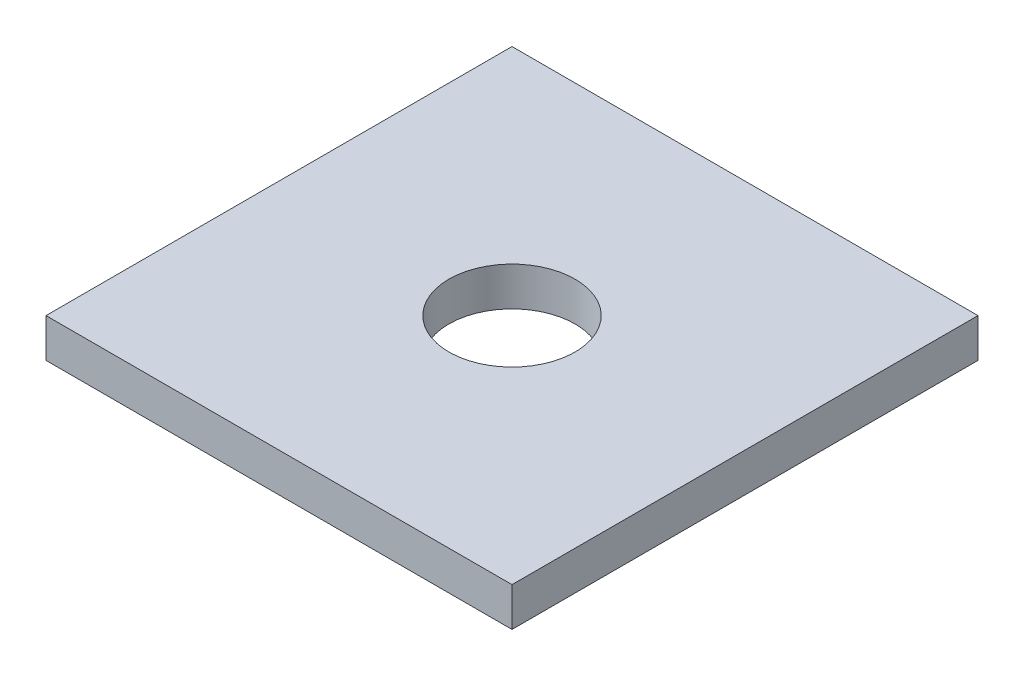
ISO-10303-21;
HEADER;
FILE_DESCRIPTION(('STEP AP214'),'2;1');
FILE_NAME('part.step','',(''),(''),'','','');
FILE_SCHEMA(('AUTOMOTIVE_DESIGN { 1 0 10303 214 1 1 1 1 }'));
ENDSEC;
DATA;
#1=APPLICATION_CONTEXT('core data for automotive mechanical design processes');
#2=APPLICATION_PROTOCOL_DEFINITION('international standard','automotive_design',2000,#1);
#3=PRODUCT_CONTEXT('',#1,'mechanical');
#4=PRODUCT('Part','Part','',(#3));
#5=PRODUCT_RELATED_PRODUCT_CATEGORY('part','',(#4));
#6=PRODUCT_DEFINITION_FORMATION('','',#4);
#7=PRODUCT_DEFINITION_CONTEXT('part definition',#1,'design');
#8=PRODUCT_DEFINITION('design','',#6,#7);
#9=PRODUCT_DEFINITION_SHAPE('','',#8);
#10=(LENGTH_UNIT() NAMED_UNIT(*) SI_UNIT(.MILLI.,.METRE.));
#11=(NAMED_UNIT(*) PLANE_ANGLE_UNIT() SI_UNIT($,.RADIAN.));
#12=(NAMED_UNIT(*) SI_UNIT($,.STERADIAN.) SOLID_ANGLE_UNIT());
#13=UNCERTAINTY_MEASURE_WITH_UNIT(LENGTH_MEASURE(1.E-05),#10,'distance_accuracy_value','');
#14=(GEOMETRIC_REPRESENTATION_CONTEXT(3) GLOBAL_UNCERTAINTY_ASSIGNED_CONTEXT((#13)) GLOBAL_UNIT_ASSIGNED_CONTEXT((#10,
#11,#12)) REPRESENTATION_CONTEXT('',''));
#15=CARTESIAN_POINT('',(0.,0.,0.));
#16=DIRECTION('',(0.,0.,1.));
#17=DIRECTION('',(1.,0.,0.));
#18=AXIS2_PLACEMENT_3D('',#15,#16,#17);
#19=CARTESIAN_POINT('',(368.3,-31.75,644.111067355815));
#20=DIRECTION('',(0.,1.,0.));
#21=DIRECTION('',(-1.,0.,0.));
#22=AXIS2_PLACEMENT_3D('',#19,#20,#21);
#23=PLANE('',#22);
#24=DIRECTION('',(1.,0.,0.));
#25=VECTOR('',#24,1.);
#26=CARTESIAN_POINT('',(368.3,-31.75,644.111067355815));
#27=LINE('',#26,#25);
#28=CARTESIAN_POINT('',(292.1,-31.75,644.111067355815));
#29=VERTEX_POINT('',#28);
#30=CARTESIAN_POINT('',(368.3,-31.75,644.111067355815));
#31=VERTEX_POINT('',#30);
#32=EDGE_CURVE('E57',#29,#31,#27,.T.);
#33=ORIENTED_EDGE('',*,*,#32,.T.);
#34=DIRECTION('',(0.,0.,1.));
#35=VECTOR('',#34,1.);
#36=CARTESIAN_POINT('',(368.3,-31.75,644.111067355815));
#37=LINE('',#36,#35);
#38=CARTESIAN_POINT('',(368.3,-31.75,720.311067355815));
#39=VERTEX_POINT('',#38);
#40=EDGE_CURVE('E54',#39,#31,#37,.F.);
#41=ORIENTED_EDGE('',*,*,#40,.F.);
#42=DIRECTION('',(1.,0.,0.));
#43=VECTOR('',#42,1.);
#44=CARTESIAN_POINT('',(368.3,-31.75,720.311067355815));
#45=LINE('',#44,#43);
#46=CARTESIAN_POINT('',(292.1,-31.75,720.311067355815));
#47=VERTEX_POINT('',#46);
#48=EDGE_CURVE('E90',#39,#47,#45,.F.);
#49=ORIENTED_EDGE('',*,*,#48,.T.);
#50=DIRECTION('',(0.,0.,1.));
#51=VECTOR('',#50,1.);
#52=CARTESIAN_POINT('',(292.1,-31.75,644.111067355815));
#53=LINE('',#52,#51);
#54=EDGE_CURVE('E59',#47,#29,#53,.F.);
#55=ORIENTED_EDGE('',*,*,#54,.T.);
#56=EDGE_LOOP('',(#33,#41,#49,#55));
#57=FACE_BOUND('',#56,.T.);
#58=CARTESIAN_POINT('',(330.2,-31.75,682.211067355815));
#59=DIRECTION('',(0.,1.,0.));
#60=DIRECTION('',(-1.,0.,0.));
#61=AXIS2_PLACEMENT_3D('',#58,#59,#60);
#62=CIRCLE('',#61,10.31875);
#63=CARTESIAN_POINT('',(319.88125,-31.75,682.211067355815));
#64=VERTEX_POINT('',#63);
#65=EDGE_CURVE('E19',#64,#64,#62,.T.);
#66=ORIENTED_EDGE('',*,*,#65,.T.);
#67=EDGE_LOOP('',(#66));
#68=FACE_BOUND('',#67,.T.);
#69=ADVANCED_FACE('F16',(#57,#68),#23,.F.);
#70=CARTESIAN_POINT('',(330.2,-25.4,682.211067355815));
#71=DIRECTION('',(0.,1.,0.));
#72=DIRECTION('',(-1.,0.,0.));
#73=AXIS2_PLACEMENT_3D('',#70,#71,#72);
#74=CYLINDRICAL_SURFACE('',#73,10.31875);
#75=ORIENTED_EDGE('',*,*,#65,.F.);
#76=EDGE_LOOP('',(#75));
#77=FACE_BOUND('',#76,.T.);
#78=CARTESIAN_POINT('',(330.2,-25.4,682.211067355815));
#79=DIRECTION('',(0.,1.,0.));
#80=DIRECTION('',(-1.,0.,0.));
#81=AXIS2_PLACEMENT_3D('',#78,#79,#80);
#82=CIRCLE('',#81,10.31875);
#83=CARTESIAN_POINT('',(319.88125,-25.4,682.211067355815));
#84=VERTEX_POINT('',#83);
#85=EDGE_CURVE('E78',#84,#84,#82,.T.);
#86=ORIENTED_EDGE('',*,*,#85,.T.);
#87=EDGE_LOOP('',(#86));
#88=FACE_BOUND('',#87,.T.);
#89=ADVANCED_FACE('F113',(#77,#88),#74,.F.);
#90=CARTESIAN_POINT('',(368.3,-31.75,644.111067355815));
#91=DIRECTION('',(0.,0.,1.));
#92=DIRECTION('',(0.,-1.,0.));
#93=AXIS2_PLACEMENT_3D('',#90,#91,#92);
#94=PLANE('',#93);
#95=DIRECTION('',(1.,0.,0.));
#96=VECTOR('',#95,1.);
#97=CARTESIAN_POINT('',(368.3,-25.4,644.111067355815));
#98=LINE('',#97,#96);
#99=CARTESIAN_POINT('',(292.1,-25.4,644.111067355815));
#100=VERTEX_POINT('',#99);
#101=CARTESIAN_POINT('',(368.3,-25.4,644.111067355815));
#102=VERTEX_POINT('',#101);
#103=EDGE_CURVE('E75',#100,#102,#98,.T.);
#104=ORIENTED_EDGE('',*,*,#103,.T.);
#105=DIRECTION('',(0.,1.,0.));
#106=VECTOR('',#105,1.);
#107=CARTESIAN_POINT('',(368.3,-25.4,644.111067355815));
#108=LINE('',#107,#106);
#109=EDGE_CURVE('E64',#31,#102,#108,.T.);
#110=ORIENTED_EDGE('',*,*,#109,.F.);
#111=ORIENTED_EDGE('',*,*,#32,.F.);
#112=DIRECTION('',(0.,1.,0.));
#113=VECTOR('',#112,1.);
#114=CARTESIAN_POINT('',(292.1,-25.4,644.111067355815));
#115=LINE('',#114,#113);
#116=EDGE_CURVE('E80',#29,#100,#115,.T.);
#117=ORIENTED_EDGE('',*,*,#116,.T.);
#118=EDGE_LOOP('',(#104,#110,#111,#117));
#119=FACE_BOUND('',#118,.T.);
#120=ADVANCED_FACE('F74',(#119),#94,.F.);
#121=CARTESIAN_POINT('',(368.3,-25.4,644.111067355815));
#122=DIRECTION('',(1.,0.,0.));
#123=DIRECTION('',(0.,1.,0.));
#124=AXIS2_PLACEMENT_3D('',#121,#122,#123);
#125=PLANE('',#124);
#126=DIRECTION('',(0.,1.,0.));
#127=VECTOR('',#126,1.);
#128=CARTESIAN_POINT('',(368.3,-31.75,720.311067355815));
#129=LINE('',#128,#127);
#130=CARTESIAN_POINT('',(368.3,-25.4,720.311067355815));
#131=VERTEX_POINT('',#130);
#132=EDGE_CURVE('E71',#131,#39,#129,.F.);
#133=ORIENTED_EDGE('',*,*,#132,.T.);
#134=ORIENTED_EDGE('',*,*,#40,.T.);
#135=ORIENTED_EDGE('',*,*,#109,.T.);
#136=DIRECTION('',(0.,0.,1.));
#137=VECTOR('',#136,1.);
#138=CARTESIAN_POINT('',(368.3,-25.4,644.111067355815));
#139=LINE('',#138,#137);
#140=EDGE_CURVE('E83',#102,#131,#139,.T.);
#141=ORIENTED_EDGE('',*,*,#140,.T.);
#142=EDGE_LOOP('',(#133,#134,#135,#141));
#143=FACE_BOUND('',#142,.T.);
#144=ADVANCED_FACE('F68',(#143),#125,.T.);
#145=CARTESIAN_POINT('',(368.3,-31.75,720.311067355815));
#146=DIRECTION('',(0.,0.,-1.));
#147=DIRECTION('',(0.,1.,0.));
#148=AXIS2_PLACEMENT_3D('',#145,#146,#147);
#149=PLANE('',#148);
#150=ORIENTED_EDGE('',*,*,#48,.F.);
#151=ORIENTED_EDGE('',*,*,#132,.F.);
#152=DIRECTION('',(1.,0.,0.));
#153=VECTOR('',#152,1.);
#154=CARTESIAN_POINT('',(368.3,-25.4,720.311067355815));
#155=LINE('',#154,#153);
#156=CARTESIAN_POINT('',(292.1,-25.4,720.311067355815));
#157=VERTEX_POINT('',#156);
#158=EDGE_CURVE('E25',#131,#157,#155,.F.);
#159=ORIENTED_EDGE('',*,*,#158,.T.);
#160=DIRECTION('',(0.,1.,0.));
#161=VECTOR('',#160,1.);
#162=CARTESIAN_POINT('',(292.1,-25.4,720.311067355815));
#163=LINE('',#162,#161);
#164=EDGE_CURVE('E33',#157,#47,#163,.F.);
#165=ORIENTED_EDGE('',*,*,#164,.T.);
#166=EDGE_LOOP('',(#150,#151,#159,#165));
#167=FACE_BOUND('',#166,.T.);
#168=ADVANCED_FACE('F94',(#167),#149,.F.);
#169=CARTESIAN_POINT('',(292.1,-25.4,644.111067355815));
#170=DIRECTION('',(1.,0.,0.));
#171=DIRECTION('',(0.,1.,0.));
#172=AXIS2_PLACEMENT_3D('',#169,#170,#171);
#173=PLANE('',#172);
#174=ORIENTED_EDGE('',*,*,#54,.F.);
#175=ORIENTED_EDGE('',*,*,#164,.F.);
#176=DIRECTION('',(0.,0.,1.));
#177=VECTOR('',#176,1.);
#178=CARTESIAN_POINT('',(292.1,-25.4,644.111067355815));
#179=LINE('',#178,#177);
#180=EDGE_CURVE('E11',#157,#100,#179,.F.);
#181=ORIENTED_EDGE('',*,*,#180,.T.);
#182=ORIENTED_EDGE('',*,*,#116,.F.);
#183=EDGE_LOOP('',(#174,#175,#181,#182));
#184=FACE_BOUND('',#183,.T.);
#185=ADVANCED_FACE('F92',(#184),#173,.F.);
#186=CARTESIAN_POINT('',(368.3,-25.4,644.111067355815));
#187=DIRECTION('',(0.,-1.,0.));
#188=DIRECTION('',(1.,0.,0.));
#189=AXIS2_PLACEMENT_3D('',#186,#187,#188);
#190=PLANE('',#189);
#191=ORIENTED_EDGE('',*,*,#158,.F.);
#192=ORIENTED_EDGE('',*,*,#140,.F.);
#193=ORIENTED_EDGE('',*,*,#103,.F.);
#194=ORIENTED_EDGE('',*,*,#180,.F.);
#195=EDGE_LOOP('',(#191,#192,#193,#194));
#196=FACE_BOUND('',#195,.T.);
#197=ORIENTED_EDGE('',*,*,#85,.F.);
#198=EDGE_LOOP('',(#197));
#199=FACE_BOUND('',#198,.T.);
#200=ADVANCED_FACE('F98',(#196,#199),#190,.F.);
#201=CLOSED_SHELL('',(#69,#89,#120,#144,#168,#185,#200));
#202=MANIFOLD_SOLID_BREP('B1',#201);
#203=ADVANCED_BREP_SHAPE_REPRESENTATION('',(#18,#202),#14);
#204=SHAPE_DEFINITION_REPRESENTATION(#9,#203);
ENDSEC;
END-ISO-10303-21;
